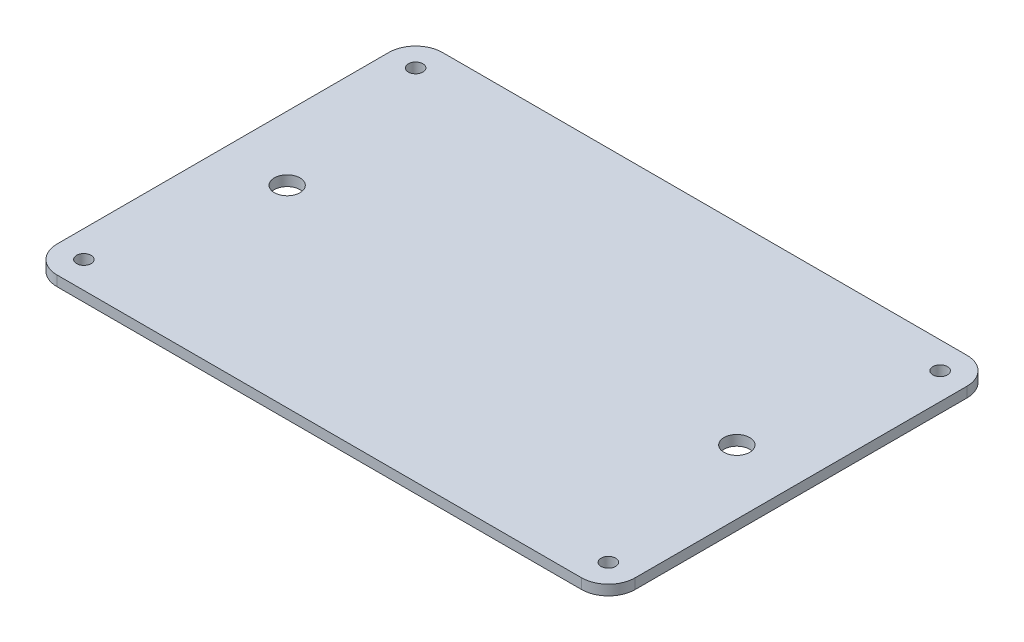
ISO-10303-21;
HEADER;
FILE_DESCRIPTION(('STEP AP214'),'2;1');
FILE_NAME('part.step','',(''),(''),'','','');
FILE_SCHEMA(('AUTOMOTIVE_DESIGN { 1 0 10303 214 1 1 1 1 }'));
ENDSEC;
DATA;
#1=APPLICATION_CONTEXT('core data for automotive mechanical design processes');
#2=APPLICATION_PROTOCOL_DEFINITION('international standard','automotive_design',2000,#1);
#3=PRODUCT_CONTEXT('',#1,'mechanical');
#4=PRODUCT('Part','Part','',(#3));
#5=PRODUCT_RELATED_PRODUCT_CATEGORY('part','',(#4));
#6=PRODUCT_DEFINITION_FORMATION('','',#4);
#7=PRODUCT_DEFINITION_CONTEXT('part definition',#1,'design');
#8=PRODUCT_DEFINITION('design','',#6,#7);
#9=PRODUCT_DEFINITION_SHAPE('','',#8);
#10=(LENGTH_UNIT() NAMED_UNIT(*) SI_UNIT(.MILLI.,.METRE.));
#11=(NAMED_UNIT(*) PLANE_ANGLE_UNIT() SI_UNIT($,.RADIAN.));
#12=(NAMED_UNIT(*) SI_UNIT($,.STERADIAN.) SOLID_ANGLE_UNIT());
#13=UNCERTAINTY_MEASURE_WITH_UNIT(LENGTH_MEASURE(1.E-05),#10,'distance_accuracy_value','');
#14=(GEOMETRIC_REPRESENTATION_CONTEXT(3) GLOBAL_UNCERTAINTY_ASSIGNED_CONTEXT((#13)) GLOBAL_UNIT_ASSIGNED_CONTEXT((#10,
#11,#12)) REPRESENTATION_CONTEXT('',''));
#15=CARTESIAN_POINT('',(0.,0.,0.));
#16=DIRECTION('',(0.,0.,1.));
#17=DIRECTION('',(1.,0.,0.));
#18=AXIS2_PLACEMENT_3D('',#15,#16,#17);
#19=CARTESIAN_POINT('',(-40.825,1.59,-25.825));
#20=DIRECTION('',(0.,1.,0.));
#21=DIRECTION('',(0.,0.,1.));
#22=AXIS2_PLACEMENT_3D('',#19,#20,#21);
#23=PLANE('',#22);
#24=CARTESIAN_POINT('',(35.,1.59,0.));
#25=DIRECTION('',(0.,-1.,0.));
#26=DIRECTION('',(0.,0.,-1.));
#27=AXIS2_PLACEMENT_3D('',#24,#25,#26);
#28=CIRCLE('',#27,2.);
#29=CARTESIAN_POINT('',(35.,1.59,-2.));
#30=VERTEX_POINT('',#29);
#31=EDGE_CURVE('E205',#30,#30,#28,.T.);
#32=ORIENTED_EDGE('',*,*,#31,.T.);
#33=EDGE_LOOP('',(#32));
#34=FACE_BOUND('',#33,.T.);
#35=CARTESIAN_POINT('',(-35.,1.59,0.));
#36=DIRECTION('',(0.,-1.,0.));
#37=DIRECTION('',(0.,0.,-1.));
#38=AXIS2_PLACEMENT_3D('',#35,#36,#37);
#39=CIRCLE('',#38,2.);
#40=CARTESIAN_POINT('',(-35.,1.59,-2.));
#41=VERTEX_POINT('',#40);
#42=EDGE_CURVE('E199',#41,#41,#39,.T.);
#43=ORIENTED_EDGE('',*,*,#42,.T.);
#44=EDGE_LOOP('',(#43));
#45=FACE_BOUND('',#44,.T.);
#46=CARTESIAN_POINT('',(-40.825,1.59,25.825));
#47=DIRECTION('',(0.,1.,0.));
#48=DIRECTION('',(0.,0.,1.));
#49=AXIS2_PLACEMENT_3D('',#46,#47,#48);
#50=CIRCLE('',#49,1.1303);
#51=CARTESIAN_POINT('',(-40.825,1.59,24.6947));
#52=VERTEX_POINT('',#51);
#53=EDGE_CURVE('E187',#52,#52,#50,.T.);
#54=ORIENTED_EDGE('',*,*,#53,.F.);
#55=EDGE_LOOP('',(#54));
#56=FACE_BOUND('',#55,.T.);
#57=CARTESIAN_POINT('',(40.825,1.59,-25.825));
#58=DIRECTION('',(0.,1.,0.));
#59=DIRECTION('',(0.,0.,1.));
#60=AXIS2_PLACEMENT_3D('',#57,#58,#59);
#61=CIRCLE('',#60,1.1303);
#62=CARTESIAN_POINT('',(40.825,1.59,-26.9553));
#63=VERTEX_POINT('',#62);
#64=EDGE_CURVE('E133',#63,#63,#61,.T.);
#65=ORIENTED_EDGE('',*,*,#64,.F.);
#66=EDGE_LOOP('',(#65));
#67=FACE_BOUND('',#66,.T.);
#68=CARTESIAN_POINT('',(-40.825,1.59,-25.825));
#69=DIRECTION('',(0.,1.,0.));
#70=DIRECTION('',(0.,0.,1.));
#71=AXIS2_PLACEMENT_3D('',#68,#69,#70);
#72=CIRCLE('',#71,4.17499999999999);
#73=CARTESIAN_POINT('',(-40.825,1.59,-30.));
#74=VERTEX_POINT('',#73);
#75=CARTESIAN_POINT('',(-45.,1.59,-25.825));
#76=VERTEX_POINT('',#75);
#77=EDGE_CURVE('E144',#74,#76,#72,.T.);
#78=ORIENTED_EDGE('',*,*,#77,.T.);
#79=DIRECTION('',(0.,0.,1.));
#80=VECTOR('',#79,1.);
#81=CARTESIAN_POINT('',(-45.,1.59,-25.825));
#82=LINE('',#81,#80);
#83=CARTESIAN_POINT('',(-45.,1.59,25.825));
#84=VERTEX_POINT('',#83);
#85=EDGE_CURVE('E92',#76,#84,#82,.T.);
#86=ORIENTED_EDGE('',*,*,#85,.T.);
#87=CARTESIAN_POINT('',(-40.825,1.59,25.825));
#88=DIRECTION('',(0.,1.,0.));
#89=DIRECTION('',(0.,0.,1.));
#90=AXIS2_PLACEMENT_3D('',#87,#88,#89);
#91=CIRCLE('',#90,4.17500000000001);
#92=CARTESIAN_POINT('',(-40.825,1.59,30.));
#93=VERTEX_POINT('',#92);
#94=EDGE_CURVE('E159',#84,#93,#91,.T.);
#95=ORIENTED_EDGE('',*,*,#94,.T.);
#96=DIRECTION('',(1.,0.,0.));
#97=VECTOR('',#96,1.);
#98=CARTESIAN_POINT('',(-40.825,1.59,30.));
#99=LINE('',#98,#97);
#100=CARTESIAN_POINT('',(40.825,1.59,30.));
#101=VERTEX_POINT('',#100);
#102=EDGE_CURVE('E172',#93,#101,#99,.T.);
#103=ORIENTED_EDGE('',*,*,#102,.T.);
#104=CARTESIAN_POINT('',(40.825,1.59,25.825));
#105=DIRECTION('',(0.,1.,0.));
#106=DIRECTION('',(0.,0.,1.));
#107=AXIS2_PLACEMENT_3D('',#104,#105,#106);
#108=CIRCLE('',#107,4.17499999999999);
#109=CARTESIAN_POINT('',(45.,1.59,25.825));
#110=VERTEX_POINT('',#109);
#111=EDGE_CURVE('E111',#101,#110,#108,.T.);
#112=ORIENTED_EDGE('',*,*,#111,.T.);
#113=DIRECTION('',(0.,0.,-1.));
#114=VECTOR('',#113,1.);
#115=CARTESIAN_POINT('',(45.,1.59,-25.825));
#116=LINE('',#115,#114);
#117=CARTESIAN_POINT('',(45.,1.59,-25.825));
#118=VERTEX_POINT('',#117);
#119=EDGE_CURVE('E105',#110,#118,#116,.T.);
#120=ORIENTED_EDGE('',*,*,#119,.T.);
#121=CARTESIAN_POINT('',(40.825,1.59,-25.825));
#122=DIRECTION('',(0.,1.,0.));
#123=DIRECTION('',(0.,0.,1.));
#124=AXIS2_PLACEMENT_3D('',#121,#122,#123);
#125=CIRCLE('',#124,4.175);
#126=CARTESIAN_POINT('',(40.825,1.59,-30.));
#127=VERTEX_POINT('',#126);
#128=EDGE_CURVE('E109',#118,#127,#125,.T.);
#129=ORIENTED_EDGE('',*,*,#128,.T.);
#130=DIRECTION('',(-1.,0.,0.));
#131=VECTOR('',#130,1.);
#132=CARTESIAN_POINT('',(-40.825,1.59,-30.));
#133=LINE('',#132,#131);
#134=EDGE_CURVE('E49',#127,#74,#133,.T.);
#135=ORIENTED_EDGE('',*,*,#134,.T.);
#136=EDGE_LOOP('',(#78,#86,#95,#103,#112,#120,#129,#135));
#137=FACE_BOUND('',#136,.T.);
#138=CARTESIAN_POINT('',(-40.825,1.59,-25.825));
#139=DIRECTION('',(0.,1.,0.));
#140=DIRECTION('',(0.,0.,1.));
#141=AXIS2_PLACEMENT_3D('',#138,#139,#140);
#142=CIRCLE('',#141,1.1303);
#143=CARTESIAN_POINT('',(-40.825,1.59,-26.9553));
#144=VERTEX_POINT('',#143);
#145=EDGE_CURVE('E181',#144,#144,#142,.T.);
#146=ORIENTED_EDGE('',*,*,#145,.F.);
#147=EDGE_LOOP('',(#146));
#148=FACE_BOUND('',#147,.T.);
#149=CARTESIAN_POINT('',(40.825,1.59,25.825));
#150=DIRECTION('',(0.,1.,0.));
#151=DIRECTION('',(0.,0.,1.));
#152=AXIS2_PLACEMENT_3D('',#149,#150,#151);
#153=CIRCLE('',#152,1.1303);
#154=CARTESIAN_POINT('',(40.825,1.59,24.6947));
#155=VERTEX_POINT('',#154);
#156=EDGE_CURVE('E193',#155,#155,#153,.T.);
#157=ORIENTED_EDGE('',*,*,#156,.F.);
#158=EDGE_LOOP('',(#157));
#159=FACE_BOUND('',#158,.T.);
#160=ADVANCED_FACE('F32',(#34,#45,#56,#67,#137,#148,#159),#23,.T.);
#161=CARTESIAN_POINT('',(-40.825,0.,-25.825));
#162=DIRECTION('',(0.,1.,0.));
#163=DIRECTION('',(0.,0.,1.));
#164=AXIS2_PLACEMENT_3D('',#161,#162,#163);
#165=PLANE('',#164);
#166=CARTESIAN_POINT('',(35.,0.,0.));
#167=DIRECTION('',(0.,-1.,0.));
#168=DIRECTION('',(0.,0.,-1.));
#169=AXIS2_PLACEMENT_3D('',#166,#167,#168);
#170=CIRCLE('',#169,2.);
#171=CARTESIAN_POINT('',(35.,0.,-2.));
#172=VERTEX_POINT('',#171);
#173=EDGE_CURVE('E208',#172,#172,#170,.T.);
#174=ORIENTED_EDGE('',*,*,#173,.F.);
#175=EDGE_LOOP('',(#174));
#176=FACE_BOUND('',#175,.T.);
#177=CARTESIAN_POINT('',(-35.,0.,0.));
#178=DIRECTION('',(0.,-1.,0.));
#179=DIRECTION('',(0.,0.,-1.));
#180=AXIS2_PLACEMENT_3D('',#177,#178,#179);
#181=CIRCLE('',#180,2.);
#182=CARTESIAN_POINT('',(-35.,0.,-2.));
#183=VERTEX_POINT('',#182);
#184=EDGE_CURVE('E202',#183,#183,#181,.T.);
#185=ORIENTED_EDGE('',*,*,#184,.F.);
#186=EDGE_LOOP('',(#185));
#187=FACE_BOUND('',#186,.T.);
#188=CARTESIAN_POINT('',(-40.825,0.,-25.825));
#189=DIRECTION('',(0.,1.,0.));
#190=DIRECTION('',(0.,0.,1.));
#191=AXIS2_PLACEMENT_3D('',#188,#189,#190);
#192=CIRCLE('',#191,4.17499999999999);
#193=CARTESIAN_POINT('',(-40.825,0.,-30.));
#194=VERTEX_POINT('',#193);
#195=CARTESIAN_POINT('',(-45.,0.,-25.825));
#196=VERTEX_POINT('',#195);
#197=EDGE_CURVE('E129',#194,#196,#192,.T.);
#198=ORIENTED_EDGE('',*,*,#197,.F.);
#199=DIRECTION('',(-1.,0.,0.));
#200=VECTOR('',#199,1.);
#201=CARTESIAN_POINT('',(-40.825,0.,-30.));
#202=LINE('',#201,#200);
#203=CARTESIAN_POINT('',(40.825,0.,-30.));
#204=VERTEX_POINT('',#203);
#205=EDGE_CURVE('E84',#204,#194,#202,.T.);
#206=ORIENTED_EDGE('',*,*,#205,.F.);
#207=CARTESIAN_POINT('',(40.825,0.,-25.825));
#208=DIRECTION('',(0.,1.,0.));
#209=DIRECTION('',(0.,0.,1.));
#210=AXIS2_PLACEMENT_3D('',#207,#208,#209);
#211=CIRCLE('',#210,4.175);
#212=CARTESIAN_POINT('',(45.,0.,-25.825));
#213=VERTEX_POINT('',#212);
#214=EDGE_CURVE('E78',#213,#204,#211,.T.);
#215=ORIENTED_EDGE('',*,*,#214,.F.);
#216=DIRECTION('',(0.,0.,-1.));
#217=VECTOR('',#216,1.);
#218=CARTESIAN_POINT('',(45.,0.,-25.825));
#219=LINE('',#218,#217);
#220=CARTESIAN_POINT('',(45.,0.,25.825));
#221=VERTEX_POINT('',#220);
#222=EDGE_CURVE('E119',#221,#213,#219,.T.);
#223=ORIENTED_EDGE('',*,*,#222,.F.);
#224=CARTESIAN_POINT('',(40.825,0.,25.825));
#225=DIRECTION('',(0.,1.,0.));
#226=DIRECTION('',(0.,0.,1.));
#227=AXIS2_PLACEMENT_3D('',#224,#225,#226);
#228=CIRCLE('',#227,4.17499999999999);
#229=CARTESIAN_POINT('',(40.825,0.,30.));
#230=VERTEX_POINT('',#229);
#231=EDGE_CURVE('E139',#230,#221,#228,.T.);
#232=ORIENTED_EDGE('',*,*,#231,.F.);
#233=DIRECTION('',(1.,0.,0.));
#234=VECTOR('',#233,1.);
#235=CARTESIAN_POINT('',(-40.825,0.,30.));
#236=LINE('',#235,#234);
#237=CARTESIAN_POINT('',(-40.825,0.,30.));
#238=VERTEX_POINT('',#237);
#239=EDGE_CURVE('E137',#238,#230,#236,.T.);
#240=ORIENTED_EDGE('',*,*,#239,.F.);
#241=CARTESIAN_POINT('',(-40.825,0.,25.825));
#242=DIRECTION('',(0.,1.,0.));
#243=DIRECTION('',(0.,0.,1.));
#244=AXIS2_PLACEMENT_3D('',#241,#242,#243);
#245=CIRCLE('',#244,4.17500000000001);
#246=CARTESIAN_POINT('',(-45.,0.,25.825));
#247=VERTEX_POINT('',#246);
#248=EDGE_CURVE('E135',#247,#238,#245,.T.);
#249=ORIENTED_EDGE('',*,*,#248,.F.);
#250=DIRECTION('',(0.,0.,1.));
#251=VECTOR('',#250,1.);
#252=CARTESIAN_POINT('',(-45.,0.,-25.825));
#253=LINE('',#252,#251);
#254=EDGE_CURVE('E132',#196,#247,#253,.T.);
#255=ORIENTED_EDGE('',*,*,#254,.F.);
#256=EDGE_LOOP('',(#198,#206,#215,#223,#232,#240,#249,#255));
#257=FACE_BOUND('',#256,.T.);
#258=CARTESIAN_POINT('',(40.825,0.,-25.825));
#259=DIRECTION('',(0.,1.,0.));
#260=DIRECTION('',(0.,0.,1.));
#261=AXIS2_PLACEMENT_3D('',#258,#259,#260);
#262=CIRCLE('',#261,1.1303);
#263=CARTESIAN_POINT('',(40.825,0.,-26.9553));
#264=VERTEX_POINT('',#263);
#265=EDGE_CURVE('E178',#264,#264,#262,.T.);
#266=ORIENTED_EDGE('',*,*,#265,.T.);
#267=EDGE_LOOP('',(#266));
#268=FACE_BOUND('',#267,.T.);
#269=CARTESIAN_POINT('',(-40.825,0.,-25.825));
#270=DIRECTION('',(0.,1.,0.));
#271=DIRECTION('',(0.,0.,1.));
#272=AXIS2_PLACEMENT_3D('',#269,#270,#271);
#273=CIRCLE('',#272,1.1303);
#274=CARTESIAN_POINT('',(-40.825,0.,-26.9553));
#275=VERTEX_POINT('',#274);
#276=EDGE_CURVE('E184',#275,#275,#273,.T.);
#277=ORIENTED_EDGE('',*,*,#276,.T.);
#278=EDGE_LOOP('',(#277));
#279=FACE_BOUND('',#278,.T.);
#280=CARTESIAN_POINT('',(-40.825,0.,25.825));
#281=DIRECTION('',(0.,1.,0.));
#282=DIRECTION('',(0.,0.,1.));
#283=AXIS2_PLACEMENT_3D('',#280,#281,#282);
#284=CIRCLE('',#283,1.1303);
#285=CARTESIAN_POINT('',(-40.825,0.,24.6947));
#286=VERTEX_POINT('',#285);
#287=EDGE_CURVE('E190',#286,#286,#284,.T.);
#288=ORIENTED_EDGE('',*,*,#287,.T.);
#289=EDGE_LOOP('',(#288));
#290=FACE_BOUND('',#289,.T.);
#291=CARTESIAN_POINT('',(40.825,0.,25.825));
#292=DIRECTION('',(0.,1.,0.));
#293=DIRECTION('',(0.,0.,1.));
#294=AXIS2_PLACEMENT_3D('',#291,#292,#293);
#295=CIRCLE('',#294,1.1303);
#296=CARTESIAN_POINT('',(40.825,0.,24.6947));
#297=VERTEX_POINT('',#296);
#298=EDGE_CURVE('E196',#297,#297,#295,.T.);
#299=ORIENTED_EDGE('',*,*,#298,.T.);
#300=EDGE_LOOP('',(#299));
#301=FACE_BOUND('',#300,.T.);
#302=ADVANCED_FACE('F163',(#176,#187,#257,#268,#279,#290,#301),#165,.F.);
#303=CARTESIAN_POINT('',(-40.825,1.59,-25.825));
#304=DIRECTION('',(0.,-1.,0.));
#305=DIRECTION('',(0.,0.,-1.));
#306=AXIS2_PLACEMENT_3D('',#303,#304,#305);
#307=CYLINDRICAL_SURFACE('',#306,4.17499999999999);
#308=ORIENTED_EDGE('',*,*,#197,.T.);
#309=DIRECTION('',(0.,-1.,0.));
#310=VECTOR('',#309,1.);
#311=CARTESIAN_POINT('',(-45.,1.59,-25.825));
#312=LINE('',#311,#310);
#313=EDGE_CURVE('E11',#76,#196,#312,.T.);
#314=ORIENTED_EDGE('',*,*,#313,.F.);
#315=ORIENTED_EDGE('',*,*,#77,.F.);
#316=DIRECTION('',(0.,-1.,0.));
#317=VECTOR('',#316,1.);
#318=CARTESIAN_POINT('',(-40.825,1.59,-30.));
#319=LINE('',#318,#317);
#320=EDGE_CURVE('E125',#74,#194,#319,.T.);
#321=ORIENTED_EDGE('',*,*,#320,.T.);
#322=EDGE_LOOP('',(#308,#314,#315,#321));
#323=FACE_BOUND('',#322,.T.);
#324=ADVANCED_FACE('F34',(#323),#307,.T.);
#325=CARTESIAN_POINT('',(-45.,1.59,-25.825));
#326=DIRECTION('',(1.,0.,0.));
#327=DIRECTION('',(0.,0.,-1.));
#328=AXIS2_PLACEMENT_3D('',#325,#326,#327);
#329=PLANE('',#328);
#330=ORIENTED_EDGE('',*,*,#254,.T.);
#331=DIRECTION('',(0.,-1.,0.));
#332=VECTOR('',#331,1.);
#333=CARTESIAN_POINT('',(-45.,1.59,25.825));
#334=LINE('',#333,#332);
#335=EDGE_CURVE('E41',#84,#247,#334,.T.);
#336=ORIENTED_EDGE('',*,*,#335,.F.);
#337=ORIENTED_EDGE('',*,*,#85,.F.);
#338=ORIENTED_EDGE('',*,*,#313,.T.);
#339=EDGE_LOOP('',(#330,#336,#337,#338));
#340=FACE_BOUND('',#339,.T.);
#341=ADVANCED_FACE('F259',(#340),#329,.F.);
#342=CARTESIAN_POINT('',(-40.825,1.59,25.825));
#343=DIRECTION('',(0.,-1.,0.));
#344=DIRECTION('',(0.,0.,-1.));
#345=AXIS2_PLACEMENT_3D('',#342,#343,#344);
#346=CYLINDRICAL_SURFACE('',#345,4.17500000000001);
#347=ORIENTED_EDGE('',*,*,#248,.T.);
#348=DIRECTION('',(0.,-1.,0.));
#349=VECTOR('',#348,1.);
#350=CARTESIAN_POINT('',(-40.825,1.59,30.));
#351=LINE('',#350,#349);
#352=EDGE_CURVE('E151',#93,#238,#351,.T.);
#353=ORIENTED_EDGE('',*,*,#352,.F.);
#354=ORIENTED_EDGE('',*,*,#94,.F.);
#355=ORIENTED_EDGE('',*,*,#335,.T.);
#356=EDGE_LOOP('',(#347,#353,#354,#355));
#357=FACE_BOUND('',#356,.T.);
#358=ADVANCED_FACE('F157',(#357),#346,.T.);
#359=CARTESIAN_POINT('',(-40.825,1.59,30.));
#360=DIRECTION('',(0.,0.,-1.));
#361=DIRECTION('',(-1.,0.,0.));
#362=AXIS2_PLACEMENT_3D('',#359,#360,#361);
#363=PLANE('',#362);
#364=ORIENTED_EDGE('',*,*,#239,.T.);
#365=DIRECTION('',(0.,-1.,0.));
#366=VECTOR('',#365,1.);
#367=CARTESIAN_POINT('',(40.825,1.59,30.));
#368=LINE('',#367,#366);
#369=EDGE_CURVE('E148',#101,#230,#368,.T.);
#370=ORIENTED_EDGE('',*,*,#369,.F.);
#371=ORIENTED_EDGE('',*,*,#102,.F.);
#372=ORIENTED_EDGE('',*,*,#352,.T.);
#373=EDGE_LOOP('',(#364,#370,#371,#372));
#374=FACE_BOUND('',#373,.T.);
#375=ADVANCED_FACE('F168',(#374),#363,.F.);
#376=CARTESIAN_POINT('',(40.825,1.59,25.825));
#377=DIRECTION('',(0.,-1.,0.));
#378=DIRECTION('',(0.,0.,-1.));
#379=AXIS2_PLACEMENT_3D('',#376,#377,#378);
#380=CYLINDRICAL_SURFACE('',#379,4.17499999999999);
#381=ORIENTED_EDGE('',*,*,#231,.T.);
#382=DIRECTION('',(0.,-1.,0.));
#383=VECTOR('',#382,1.);
#384=CARTESIAN_POINT('',(45.,1.59,25.825));
#385=LINE('',#384,#383);
#386=EDGE_CURVE('E120',#110,#221,#385,.T.);
#387=ORIENTED_EDGE('',*,*,#386,.F.);
#388=ORIENTED_EDGE('',*,*,#111,.F.);
#389=ORIENTED_EDGE('',*,*,#369,.T.);
#390=EDGE_LOOP('',(#381,#387,#388,#389));
#391=FACE_BOUND('',#390,.T.);
#392=ADVANCED_FACE('F171',(#391),#380,.T.);
#393=CARTESIAN_POINT('',(45.,1.59,-25.825));
#394=DIRECTION('',(-1.,0.,0.));
#395=DIRECTION('',(0.,0.,1.));
#396=AXIS2_PLACEMENT_3D('',#393,#394,#395);
#397=PLANE('',#396);
#398=ORIENTED_EDGE('',*,*,#222,.T.);
#399=DIRECTION('',(0.,-1.,0.));
#400=VECTOR('',#399,1.);
#401=CARTESIAN_POINT('',(45.,1.59,-25.825));
#402=LINE('',#401,#400);
#403=EDGE_CURVE('E116',#118,#213,#402,.T.);
#404=ORIENTED_EDGE('',*,*,#403,.F.);
#405=ORIENTED_EDGE('',*,*,#119,.F.);
#406=ORIENTED_EDGE('',*,*,#386,.T.);
#407=EDGE_LOOP('',(#398,#404,#405,#406));
#408=FACE_BOUND('',#407,.T.);
#409=ADVANCED_FACE('F117',(#408),#397,.F.);
#410=CARTESIAN_POINT('',(40.825,1.59,-25.825));
#411=DIRECTION('',(0.,-1.,0.));
#412=DIRECTION('',(0.,0.,-1.));
#413=AXIS2_PLACEMENT_3D('',#410,#411,#412);
#414=CYLINDRICAL_SURFACE('',#413,4.175);
#415=ORIENTED_EDGE('',*,*,#214,.T.);
#416=DIRECTION('',(0.,-1.,0.));
#417=VECTOR('',#416,1.);
#418=CARTESIAN_POINT('',(40.825,1.59,-30.));
#419=LINE('',#418,#417);
#420=EDGE_CURVE('E121',#127,#204,#419,.T.);
#421=ORIENTED_EDGE('',*,*,#420,.F.);
#422=ORIENTED_EDGE('',*,*,#128,.F.);
#423=ORIENTED_EDGE('',*,*,#403,.T.);
#424=EDGE_LOOP('',(#415,#421,#422,#423));
#425=FACE_BOUND('',#424,.T.);
#426=ADVANCED_FACE('F123',(#425),#414,.T.);
#427=CARTESIAN_POINT('',(-40.825,1.59,-30.));
#428=DIRECTION('',(0.,0.,1.));
#429=DIRECTION('',(1.,0.,0.));
#430=AXIS2_PLACEMENT_3D('',#427,#428,#429);
#431=PLANE('',#430);
#432=ORIENTED_EDGE('',*,*,#205,.T.);
#433=ORIENTED_EDGE('',*,*,#320,.F.);
#434=ORIENTED_EDGE('',*,*,#134,.F.);
#435=ORIENTED_EDGE('',*,*,#420,.T.);
#436=EDGE_LOOP('',(#432,#433,#434,#435));
#437=FACE_BOUND('',#436,.T.);
#438=ADVANCED_FACE('F247',(#437),#431,.F.);
#439=CARTESIAN_POINT('',(40.825,1.59,-25.825));
#440=DIRECTION('',(0.,-1.,0.));
#441=DIRECTION('',(0.,0.,-1.));
#442=AXIS2_PLACEMENT_3D('',#439,#440,#441);
#443=CYLINDRICAL_SURFACE('',#442,1.1303);
#444=CARTESIAN_POINT('',(40.825,1.59,-26.9553));
#445=CARTESIAN_POINT('',(40.825,1.5734375,-26.9553));
#446=CARTESIAN_POINT('',(40.825,1.556875,-26.9553));
#447=CARTESIAN_POINT('',(40.825,1.52375,-26.9553));
#448=CARTESIAN_POINT('',(40.825,1.5071875,-26.9553));
#449=CARTESIAN_POINT('',(40.825,1.4740625,-26.9553));
#450=CARTESIAN_POINT('',(40.825,1.4575,-26.9553));
#451=CARTESIAN_POINT('',(40.825,1.424375,-26.9553));
#452=CARTESIAN_POINT('',(40.825,1.4078125,-26.9553));
#453=CARTESIAN_POINT('',(40.825,1.3746875,-26.9553));
#454=CARTESIAN_POINT('',(40.825,1.358125,-26.9553));
#455=CARTESIAN_POINT('',(40.825,1.325,-26.9553));
#456=CARTESIAN_POINT('',(40.825,1.3084375,-26.9553));
#457=CARTESIAN_POINT('',(40.825,1.2753125,-26.9553));
#458=CARTESIAN_POINT('',(40.825,1.25875,-26.9553));
#459=CARTESIAN_POINT('',(40.825,1.225625,-26.9553));
#460=CARTESIAN_POINT('',(40.825,1.2090625,-26.9553));
#461=CARTESIAN_POINT('',(40.825,1.1759375,-26.9553));
#462=CARTESIAN_POINT('',(40.825,1.159375,-26.9553));
#463=CARTESIAN_POINT('',(40.825,1.12625,-26.9553));
#464=CARTESIAN_POINT('',(40.825,1.1096875,-26.9553));
#465=CARTESIAN_POINT('',(40.825,1.0765625,-26.9553));
#466=CARTESIAN_POINT('',(40.825,1.06,-26.9553));
#467=CARTESIAN_POINT('',(40.825,1.026875,-26.9553));
#468=CARTESIAN_POINT('',(40.825,1.0103125,-26.9553));
#469=CARTESIAN_POINT('',(40.825,0.9771875,-26.9553));
#470=CARTESIAN_POINT('',(40.825,0.960625,-26.9553));
#471=CARTESIAN_POINT('',(40.825,0.9275,-26.9553));
#472=CARTESIAN_POINT('',(40.825,0.9109375,-26.9553));
#473=CARTESIAN_POINT('',(40.825,0.8778125,-26.9553));
#474=CARTESIAN_POINT('',(40.825,0.86125,-26.9553));
#475=CARTESIAN_POINT('',(40.825,0.828125,-26.9553));
#476=CARTESIAN_POINT('',(40.825,0.8115625,-26.9553));
#477=CARTESIAN_POINT('',(40.825,0.7784375,-26.9553));
#478=CARTESIAN_POINT('',(40.825,0.761875,-26.9553));
#479=CARTESIAN_POINT('',(40.825,0.72875,-26.9553));
#480=CARTESIAN_POINT('',(40.825,0.7121875,-26.9553));
#481=CARTESIAN_POINT('',(40.825,0.6790625,-26.9553));
#482=CARTESIAN_POINT('',(40.825,0.6625,-26.9553));
#483=CARTESIAN_POINT('',(40.825,0.629375,-26.9553));
#484=CARTESIAN_POINT('',(40.825,0.6128125,-26.9553));
#485=CARTESIAN_POINT('',(40.825,0.5796875,-26.9553));
#486=CARTESIAN_POINT('',(40.825,0.563125,-26.9553));
#487=CARTESIAN_POINT('',(40.825,0.53,-26.9553));
#488=CARTESIAN_POINT('',(40.825,0.5134375,-26.9553));
#489=CARTESIAN_POINT('',(40.825,0.4803125,-26.9553));
#490=CARTESIAN_POINT('',(40.825,0.46375,-26.9553));
#491=CARTESIAN_POINT('',(40.825,0.430625,-26.9553));
#492=CARTESIAN_POINT('',(40.825,0.4140625,-26.9553));
#493=CARTESIAN_POINT('',(40.825,0.3809375,-26.9553));
#494=CARTESIAN_POINT('',(40.825,0.364375,-26.9553));
#495=CARTESIAN_POINT('',(40.825,0.33125,-26.9553));
#496=CARTESIAN_POINT('',(40.825,0.3146875,-26.9553));
#497=CARTESIAN_POINT('',(40.825,0.2815625,-26.9553));
#498=CARTESIAN_POINT('',(40.825,0.265,-26.9553));
#499=CARTESIAN_POINT('',(40.825,0.231875,-26.9553));
#500=CARTESIAN_POINT('',(40.825,0.2153125,-26.9553));
#501=CARTESIAN_POINT('',(40.825,0.1821875,-26.9553));
#502=CARTESIAN_POINT('',(40.825,0.165625,-26.9553));
#503=CARTESIAN_POINT('',(40.825,0.1325,-26.9553));
#504=CARTESIAN_POINT('',(40.825,0.1159375,-26.9553));
#505=CARTESIAN_POINT('',(40.825,0.0828125000000001,-26.9553));
#506=CARTESIAN_POINT('',(40.825,0.06625,-26.9553));
#507=CARTESIAN_POINT('',(40.825,0.033125,-26.9553));
#508=CARTESIAN_POINT('',(40.825,0.0165625,-26.9553));
#509=CARTESIAN_POINT('',(40.825,0.,-26.9553));
#510=B_SPLINE_CURVE_WITH_KNOTS('',3,(#444,#445,#446,#447,#448,#449,#450,#451,#452,#453,#454,
#455,#456,#457,#458,#459,#460,#461,#462,#463,#464,#465,#466,#467,#468,#469,#470,#471,#472,#473,
#474,#475,#476,#477,#478,#479,#480,#481,#482,#483,#484,#485,#486,#487,#488,#489,#490,#491,#492,
#493,#494,#495,#496,#497,#498,#499,#500,#501,#502,#503,#504,#505,#506,#507,#508,#509),
.UNSPECIFIED.,.F.,.F.,(4,2,2,2,2,2,2,2,2,2,2,2,2,2,2,2,2,2,2,2,2,2,2,2,2,2,2,2,2,2,2,2,4),(0.,
0.0496875,0.0993750000000001,0.1490625,0.19875,0.2484375,0.298125,0.3478125,0.3975,0.4471875,
0.496875,0.5465625,0.59625,0.6459375,0.695625,0.7453125,0.795,0.8446875,0.894375,0.9440625,
0.99375,1.0434375,1.093125,1.1428125,1.1925,1.2421875,1.291875,1.3415625,1.39125,1.4409375,
1.490625,1.5403125,1.59),.UNSPECIFIED.);
#511=EDGE_CURVE('BSEAM244',#63,#264,#510,.T.);
#512=ORIENTED_EDGE('',*,*,#64,.T.);
#513=ORIENTED_EDGE('',*,*,#265,.F.);
#514=ORIENTED_EDGE('',*,*,#511,.T.);
#515=ORIENTED_EDGE('',*,*,#511,.F.);
#516=EDGE_LOOP('',(#512,#514,#513,#515));
#517=FACE_BOUND('',#516,.T.);
#518=ADVANCED_FACE('F244',(#517),#443,.F.);
#519=CARTESIAN_POINT('',(-40.825,1.59,-25.825));
#520=DIRECTION('',(0.,-1.,0.));
#521=DIRECTION('',(0.,0.,-1.));
#522=AXIS2_PLACEMENT_3D('',#519,#520,#521);
#523=CYLINDRICAL_SURFACE('',#522,1.1303);
#524=CARTESIAN_POINT('',(-40.825,1.59,-26.9553));
#525=CARTESIAN_POINT('',(-40.825,1.5734375,-26.9553));
#526=CARTESIAN_POINT('',(-40.825,1.556875,-26.9553));
#527=CARTESIAN_POINT('',(-40.825,1.52375,-26.9553));
#528=CARTESIAN_POINT('',(-40.825,1.5071875,-26.9553));
#529=CARTESIAN_POINT('',(-40.825,1.4740625,-26.9553));
#530=CARTESIAN_POINT('',(-40.825,1.4575,-26.9553));
#531=CARTESIAN_POINT('',(-40.825,1.424375,-26.9553));
#532=CARTESIAN_POINT('',(-40.825,1.4078125,-26.9553));
#533=CARTESIAN_POINT('',(-40.825,1.3746875,-26.9553));
#534=CARTESIAN_POINT('',(-40.825,1.358125,-26.9553));
#535=CARTESIAN_POINT('',(-40.825,1.325,-26.9553));
#536=CARTESIAN_POINT('',(-40.825,1.3084375,-26.9553));
#537=CARTESIAN_POINT('',(-40.825,1.2753125,-26.9553));
#538=CARTESIAN_POINT('',(-40.825,1.25875,-26.9553));
#539=CARTESIAN_POINT('',(-40.825,1.225625,-26.9553));
#540=CARTESIAN_POINT('',(-40.825,1.2090625,-26.9553));
#541=CARTESIAN_POINT('',(-40.825,1.1759375,-26.9553));
#542=CARTESIAN_POINT('',(-40.825,1.159375,-26.9553));
#543=CARTESIAN_POINT('',(-40.825,1.12625,-26.9553));
#544=CARTESIAN_POINT('',(-40.825,1.1096875,-26.9553));
#545=CARTESIAN_POINT('',(-40.825,1.0765625,-26.9553));
#546=CARTESIAN_POINT('',(-40.825,1.06,-26.9553));
#547=CARTESIAN_POINT('',(-40.825,1.026875,-26.9553));
#548=CARTESIAN_POINT('',(-40.825,1.0103125,-26.9553));
#549=CARTESIAN_POINT('',(-40.825,0.9771875,-26.9553));
#550=CARTESIAN_POINT('',(-40.825,0.960625,-26.9553));
#551=CARTESIAN_POINT('',(-40.825,0.9275,-26.9553));
#552=CARTESIAN_POINT('',(-40.825,0.9109375,-26.9553));
#553=CARTESIAN_POINT('',(-40.825,0.8778125,-26.9553));
#554=CARTESIAN_POINT('',(-40.825,0.86125,-26.9553));
#555=CARTESIAN_POINT('',(-40.825,0.828125,-26.9553));
#556=CARTESIAN_POINT('',(-40.825,0.8115625,-26.9553));
#557=CARTESIAN_POINT('',(-40.825,0.7784375,-26.9553));
#558=CARTESIAN_POINT('',(-40.825,0.761875,-26.9553));
#559=CARTESIAN_POINT('',(-40.825,0.72875,-26.9553));
#560=CARTESIAN_POINT('',(-40.825,0.7121875,-26.9553));
#561=CARTESIAN_POINT('',(-40.825,0.6790625,-26.9553));
#562=CARTESIAN_POINT('',(-40.825,0.6625,-26.9553));
#563=CARTESIAN_POINT('',(-40.825,0.629375,-26.9553));
#564=CARTESIAN_POINT('',(-40.825,0.6128125,-26.9553));
#565=CARTESIAN_POINT('',(-40.825,0.5796875,-26.9553));
#566=CARTESIAN_POINT('',(-40.825,0.563125,-26.9553));
#567=CARTESIAN_POINT('',(-40.825,0.53,-26.9553));
#568=CARTESIAN_POINT('',(-40.825,0.5134375,-26.9553));
#569=CARTESIAN_POINT('',(-40.825,0.4803125,-26.9553));
#570=CARTESIAN_POINT('',(-40.825,0.46375,-26.9553));
#571=CARTESIAN_POINT('',(-40.825,0.430625,-26.9553));
#572=CARTESIAN_POINT('',(-40.825,0.4140625,-26.9553));
#573=CARTESIAN_POINT('',(-40.825,0.3809375,-26.9553));
#574=CARTESIAN_POINT('',(-40.825,0.364375,-26.9553));
#575=CARTESIAN_POINT('',(-40.825,0.33125,-26.9553));
#576=CARTESIAN_POINT('',(-40.825,0.3146875,-26.9553));
#577=CARTESIAN_POINT('',(-40.825,0.2815625,-26.9553));
#578=CARTESIAN_POINT('',(-40.825,0.265,-26.9553));
#579=CARTESIAN_POINT('',(-40.825,0.231875,-26.9553));
#580=CARTESIAN_POINT('',(-40.825,0.2153125,-26.9553));
#581=CARTESIAN_POINT('',(-40.825,0.1821875,-26.9553));
#582=CARTESIAN_POINT('',(-40.825,0.165625,-26.9553));
#583=CARTESIAN_POINT('',(-40.825,0.1325,-26.9553));
#584=CARTESIAN_POINT('',(-40.825,0.1159375,-26.9553));
#585=CARTESIAN_POINT('',(-40.825,0.0828125000000001,-26.9553));
#586=CARTESIAN_POINT('',(-40.825,0.06625,-26.9553));
#587=CARTESIAN_POINT('',(-40.825,0.033125,-26.9553));
#588=CARTESIAN_POINT('',(-40.825,0.0165625,-26.9553));
#589=CARTESIAN_POINT('',(-40.825,0.,-26.9553));
#590=B_SPLINE_CURVE_WITH_KNOTS('',3,(#524,#525,#526,#527,#528,#529,#530,#531,#532,#533,#534,
#535,#536,#537,#538,#539,#540,#541,#542,#543,#544,#545,#546,#547,#548,#549,#550,#551,#552,#553,
#554,#555,#556,#557,#558,#559,#560,#561,#562,#563,#564,#565,#566,#567,#568,#569,#570,#571,#572,
#573,#574,#575,#576,#577,#578,#579,#580,#581,#582,#583,#584,#585,#586,#587,#588,#589),
.UNSPECIFIED.,.F.,.F.,(4,2,2,2,2,2,2,2,2,2,2,2,2,2,2,2,2,2,2,2,2,2,2,2,2,2,2,2,2,2,2,2,4),(0.,
0.0496875,0.0993750000000001,0.1490625,0.19875,0.2484375,0.298125,0.3478125,0.3975,0.4471875,
0.496875,0.5465625,0.59625,0.6459375,0.695625,0.7453125,0.795,0.8446875,0.894375,0.9440625,
0.99375,1.0434375,1.093125,1.1428125,1.1925,1.2421875,1.291875,1.3415625,1.39125,1.4409375,
1.490625,1.5403125,1.59),.UNSPECIFIED.);
#591=EDGE_CURVE('BSEAM301',#144,#275,#590,.T.);
#592=ORIENTED_EDGE('',*,*,#145,.T.);
#593=ORIENTED_EDGE('',*,*,#276,.F.);
#594=ORIENTED_EDGE('',*,*,#591,.T.);
#595=ORIENTED_EDGE('',*,*,#591,.F.);
#596=EDGE_LOOP('',(#592,#594,#593,#595));
#597=FACE_BOUND('',#596,.T.);
#598=ADVANCED_FACE('F301',(#597),#523,.F.);
#599=CARTESIAN_POINT('',(-40.825,1.59,25.825));
#600=DIRECTION('',(0.,-1.,0.));
#601=DIRECTION('',(0.,0.,-1.));
#602=AXIS2_PLACEMENT_3D('',#599,#600,#601);
#603=CYLINDRICAL_SURFACE('',#602,1.1303);
#604=CARTESIAN_POINT('',(-40.825,1.59,24.6947));
#605=CARTESIAN_POINT('',(-40.825,1.5734375,24.6947));
#606=CARTESIAN_POINT('',(-40.825,1.556875,24.6947));
#607=CARTESIAN_POINT('',(-40.825,1.52375,24.6947));
#608=CARTESIAN_POINT('',(-40.825,1.5071875,24.6947));
#609=CARTESIAN_POINT('',(-40.825,1.4740625,24.6947));
#610=CARTESIAN_POINT('',(-40.825,1.4575,24.6947));
#611=CARTESIAN_POINT('',(-40.825,1.424375,24.6947));
#612=CARTESIAN_POINT('',(-40.825,1.4078125,24.6947));
#613=CARTESIAN_POINT('',(-40.825,1.3746875,24.6947));
#614=CARTESIAN_POINT('',(-40.825,1.358125,24.6947));
#615=CARTESIAN_POINT('',(-40.825,1.325,24.6947));
#616=CARTESIAN_POINT('',(-40.825,1.3084375,24.6947));
#617=CARTESIAN_POINT('',(-40.825,1.2753125,24.6947));
#618=CARTESIAN_POINT('',(-40.825,1.25875,24.6947));
#619=CARTESIAN_POINT('',(-40.825,1.225625,24.6947));
#620=CARTESIAN_POINT('',(-40.825,1.2090625,24.6947));
#621=CARTESIAN_POINT('',(-40.825,1.1759375,24.6947));
#622=CARTESIAN_POINT('',(-40.825,1.159375,24.6947));
#623=CARTESIAN_POINT('',(-40.825,1.12625,24.6947));
#624=CARTESIAN_POINT('',(-40.825,1.1096875,24.6947));
#625=CARTESIAN_POINT('',(-40.825,1.0765625,24.6947));
#626=CARTESIAN_POINT('',(-40.825,1.06,24.6947));
#627=CARTESIAN_POINT('',(-40.825,1.026875,24.6947));
#628=CARTESIAN_POINT('',(-40.825,1.0103125,24.6947));
#629=CARTESIAN_POINT('',(-40.825,0.9771875,24.6947));
#630=CARTESIAN_POINT('',(-40.825,0.960625,24.6947));
#631=CARTESIAN_POINT('',(-40.825,0.9275,24.6947));
#632=CARTESIAN_POINT('',(-40.825,0.9109375,24.6947));
#633=CARTESIAN_POINT('',(-40.825,0.8778125,24.6947));
#634=CARTESIAN_POINT('',(-40.825,0.86125,24.6947));
#635=CARTESIAN_POINT('',(-40.825,0.828125,24.6947));
#636=CARTESIAN_POINT('',(-40.825,0.8115625,24.6947));
#637=CARTESIAN_POINT('',(-40.825,0.7784375,24.6947));
#638=CARTESIAN_POINT('',(-40.825,0.761875,24.6947));
#639=CARTESIAN_POINT('',(-40.825,0.72875,24.6947));
#640=CARTESIAN_POINT('',(-40.825,0.7121875,24.6947));
#641=CARTESIAN_POINT('',(-40.825,0.6790625,24.6947));
#642=CARTESIAN_POINT('',(-40.825,0.6625,24.6947));
#643=CARTESIAN_POINT('',(-40.825,0.629375,24.6947));
#644=CARTESIAN_POINT('',(-40.825,0.6128125,24.6947));
#645=CARTESIAN_POINT('',(-40.825,0.5796875,24.6947));
#646=CARTESIAN_POINT('',(-40.825,0.563125,24.6947));
#647=CARTESIAN_POINT('',(-40.825,0.53,24.6947));
#648=CARTESIAN_POINT('',(-40.825,0.5134375,24.6947));
#649=CARTESIAN_POINT('',(-40.825,0.4803125,24.6947));
#650=CARTESIAN_POINT('',(-40.825,0.46375,24.6947));
#651=CARTESIAN_POINT('',(-40.825,0.430625,24.6947));
#652=CARTESIAN_POINT('',(-40.825,0.4140625,24.6947));
#653=CARTESIAN_POINT('',(-40.825,0.3809375,24.6947));
#654=CARTESIAN_POINT('',(-40.825,0.364375,24.6947));
#655=CARTESIAN_POINT('',(-40.825,0.33125,24.6947));
#656=CARTESIAN_POINT('',(-40.825,0.3146875,24.6947));
#657=CARTESIAN_POINT('',(-40.825,0.2815625,24.6947));
#658=CARTESIAN_POINT('',(-40.825,0.265,24.6947));
#659=CARTESIAN_POINT('',(-40.825,0.231875,24.6947));
#660=CARTESIAN_POINT('',(-40.825,0.2153125,24.6947));
#661=CARTESIAN_POINT('',(-40.825,0.1821875,24.6947));
#662=CARTESIAN_POINT('',(-40.825,0.165625,24.6947));
#663=CARTESIAN_POINT('',(-40.825,0.1325,24.6947));
#664=CARTESIAN_POINT('',(-40.825,0.1159375,24.6947));
#665=CARTESIAN_POINT('',(-40.825,0.0828125000000001,24.6947));
#666=CARTESIAN_POINT('',(-40.825,0.06625,24.6947));
#667=CARTESIAN_POINT('',(-40.825,0.033125,24.6947));
#668=CARTESIAN_POINT('',(-40.825,0.0165625,24.6947));
#669=CARTESIAN_POINT('',(-40.825,0.,24.6947));
#670=B_SPLINE_CURVE_WITH_KNOTS('',3,(#604,#605,#606,#607,#608,#609,#610,#611,#612,#613,#614,
#615,#616,#617,#618,#619,#620,#621,#622,#623,#624,#625,#626,#627,#628,#629,#630,#631,#632,#633,
#634,#635,#636,#637,#638,#639,#640,#641,#642,#643,#644,#645,#646,#647,#648,#649,#650,#651,#652,
#653,#654,#655,#656,#657,#658,#659,#660,#661,#662,#663,#664,#665,#666,#667,#668,#669),
.UNSPECIFIED.,.F.,.F.,(4,2,2,2,2,2,2,2,2,2,2,2,2,2,2,2,2,2,2,2,2,2,2,2,2,2,2,2,2,2,2,2,4),(0.,
0.0496875,0.0993750000000001,0.1490625,0.19875,0.2484375,0.298125,0.3478125,0.3975,0.4471875,
0.496875,0.5465625,0.59625,0.6459375,0.695625,0.7453125,0.795,0.8446875,0.894375,0.9440625,
0.99375,1.0434375,1.093125,1.1428125,1.1925,1.2421875,1.291875,1.3415625,1.39125,1.4409375,
1.490625,1.5403125,1.59),.UNSPECIFIED.);
#671=EDGE_CURVE('BSEAM235',#52,#286,#670,.T.);
#672=ORIENTED_EDGE('',*,*,#53,.T.);
#673=ORIENTED_EDGE('',*,*,#287,.F.);
#674=ORIENTED_EDGE('',*,*,#671,.T.);
#675=ORIENTED_EDGE('',*,*,#671,.F.);
#676=EDGE_LOOP('',(#672,#674,#673,#675));
#677=FACE_BOUND('',#676,.T.);
#678=ADVANCED_FACE('F235',(#677),#603,.F.);
#679=CARTESIAN_POINT('',(40.825,1.59,25.825));
#680=DIRECTION('',(0.,-1.,0.));
#681=DIRECTION('',(0.,0.,-1.));
#682=AXIS2_PLACEMENT_3D('',#679,#680,#681);
#683=CYLINDRICAL_SURFACE('',#682,1.1303);
#684=CARTESIAN_POINT('',(40.825,1.59,24.6947));
#685=CARTESIAN_POINT('',(40.825,1.5734375,24.6947));
#686=CARTESIAN_POINT('',(40.825,1.556875,24.6947));
#687=CARTESIAN_POINT('',(40.825,1.52375,24.6947));
#688=CARTESIAN_POINT('',(40.825,1.5071875,24.6947));
#689=CARTESIAN_POINT('',(40.825,1.4740625,24.6947));
#690=CARTESIAN_POINT('',(40.825,1.4575,24.6947));
#691=CARTESIAN_POINT('',(40.825,1.424375,24.6947));
#692=CARTESIAN_POINT('',(40.825,1.4078125,24.6947));
#693=CARTESIAN_POINT('',(40.825,1.3746875,24.6947));
#694=CARTESIAN_POINT('',(40.825,1.358125,24.6947));
#695=CARTESIAN_POINT('',(40.825,1.325,24.6947));
#696=CARTESIAN_POINT('',(40.825,1.3084375,24.6947));
#697=CARTESIAN_POINT('',(40.825,1.2753125,24.6947));
#698=CARTESIAN_POINT('',(40.825,1.25875,24.6947));
#699=CARTESIAN_POINT('',(40.825,1.225625,24.6947));
#700=CARTESIAN_POINT('',(40.825,1.2090625,24.6947));
#701=CARTESIAN_POINT('',(40.825,1.1759375,24.6947));
#702=CARTESIAN_POINT('',(40.825,1.159375,24.6947));
#703=CARTESIAN_POINT('',(40.825,1.12625,24.6947));
#704=CARTESIAN_POINT('',(40.825,1.1096875,24.6947));
#705=CARTESIAN_POINT('',(40.825,1.0765625,24.6947));
#706=CARTESIAN_POINT('',(40.825,1.06,24.6947));
#707=CARTESIAN_POINT('',(40.825,1.026875,24.6947));
#708=CARTESIAN_POINT('',(40.825,1.0103125,24.6947));
#709=CARTESIAN_POINT('',(40.825,0.9771875,24.6947));
#710=CARTESIAN_POINT('',(40.825,0.960625,24.6947));
#711=CARTESIAN_POINT('',(40.825,0.9275,24.6947));
#712=CARTESIAN_POINT('',(40.825,0.9109375,24.6947));
#713=CARTESIAN_POINT('',(40.825,0.8778125,24.6947));
#714=CARTESIAN_POINT('',(40.825,0.86125,24.6947));
#715=CARTESIAN_POINT('',(40.825,0.828125,24.6947));
#716=CARTESIAN_POINT('',(40.825,0.8115625,24.6947));
#717=CARTESIAN_POINT('',(40.825,0.7784375,24.6947));
#718=CARTESIAN_POINT('',(40.825,0.761875,24.6947));
#719=CARTESIAN_POINT('',(40.825,0.72875,24.6947));
#720=CARTESIAN_POINT('',(40.825,0.7121875,24.6947));
#721=CARTESIAN_POINT('',(40.825,0.6790625,24.6947));
#722=CARTESIAN_POINT('',(40.825,0.6625,24.6947));
#723=CARTESIAN_POINT('',(40.825,0.629375,24.6947));
#724=CARTESIAN_POINT('',(40.825,0.6128125,24.6947));
#725=CARTESIAN_POINT('',(40.825,0.5796875,24.6947));
#726=CARTESIAN_POINT('',(40.825,0.563125,24.6947));
#727=CARTESIAN_POINT('',(40.825,0.53,24.6947));
#728=CARTESIAN_POINT('',(40.825,0.5134375,24.6947));
#729=CARTESIAN_POINT('',(40.825,0.4803125,24.6947));
#730=CARTESIAN_POINT('',(40.825,0.46375,24.6947));
#731=CARTESIAN_POINT('',(40.825,0.430625,24.6947));
#732=CARTESIAN_POINT('',(40.825,0.4140625,24.6947));
#733=CARTESIAN_POINT('',(40.825,0.3809375,24.6947));
#734=CARTESIAN_POINT('',(40.825,0.364375,24.6947));
#735=CARTESIAN_POINT('',(40.825,0.33125,24.6947));
#736=CARTESIAN_POINT('',(40.825,0.3146875,24.6947));
#737=CARTESIAN_POINT('',(40.825,0.2815625,24.6947));
#738=CARTESIAN_POINT('',(40.825,0.265,24.6947));
#739=CARTESIAN_POINT('',(40.825,0.231875,24.6947));
#740=CARTESIAN_POINT('',(40.825,0.2153125,24.6947));
#741=CARTESIAN_POINT('',(40.825,0.1821875,24.6947));
#742=CARTESIAN_POINT('',(40.825,0.165625,24.6947));
#743=CARTESIAN_POINT('',(40.825,0.1325,24.6947));
#744=CARTESIAN_POINT('',(40.825,0.1159375,24.6947));
#745=CARTESIAN_POINT('',(40.825,0.0828125000000001,24.6947));
#746=CARTESIAN_POINT('',(40.825,0.06625,24.6947));
#747=CARTESIAN_POINT('',(40.825,0.033125,24.6947));
#748=CARTESIAN_POINT('',(40.825,0.0165625,24.6947));
#749=CARTESIAN_POINT('',(40.825,0.,24.6947));
#750=B_SPLINE_CURVE_WITH_KNOTS('',3,(#684,#685,#686,#687,#688,#689,#690,#691,#692,#693,#694,
#695,#696,#697,#698,#699,#700,#701,#702,#703,#704,#705,#706,#707,#708,#709,#710,#711,#712,#713,
#714,#715,#716,#717,#718,#719,#720,#721,#722,#723,#724,#725,#726,#727,#728,#729,#730,#731,#732,
#733,#734,#735,#736,#737,#738,#739,#740,#741,#742,#743,#744,#745,#746,#747,#748,#749),
.UNSPECIFIED.,.F.,.F.,(4,2,2,2,2,2,2,2,2,2,2,2,2,2,2,2,2,2,2,2,2,2,2,2,2,2,2,2,2,2,2,2,4),(0.,
0.0496875,0.0993750000000001,0.1490625,0.19875,0.2484375,0.298125,0.3478125,0.3975,0.4471875,
0.496875,0.5465625,0.59625,0.6459375,0.695625,0.7453125,0.795,0.8446875,0.894375,0.9440625,
0.99375,1.0434375,1.093125,1.1428125,1.1925,1.2421875,1.291875,1.3415625,1.39125,1.4409375,
1.490625,1.5403125,1.59),.UNSPECIFIED.);
#751=EDGE_CURVE('BSEAM229',#155,#297,#750,.T.);
#752=ORIENTED_EDGE('',*,*,#156,.T.);
#753=ORIENTED_EDGE('',*,*,#298,.F.);
#754=ORIENTED_EDGE('',*,*,#751,.T.);
#755=ORIENTED_EDGE('',*,*,#751,.F.);
#756=EDGE_LOOP('',(#752,#754,#753,#755));
#757=FACE_BOUND('',#756,.T.);
#758=ADVANCED_FACE('F229',(#757),#683,.F.);
#759=CARTESIAN_POINT('',(-35.,1.59,0.));
#760=DIRECTION('',(0.,-1.,0.));
#761=DIRECTION('',(0.,0.,-1.));
#762=AXIS2_PLACEMENT_3D('',#759,#760,#761);
#763=CYLINDRICAL_SURFACE('',#762,2.);
#764=CARTESIAN_POINT('',(-35.,1.59,-2.));
#765=CARTESIAN_POINT('',(-35.,1.5734375,-2.));
#766=CARTESIAN_POINT('',(-35.,1.556875,-2.));
#767=CARTESIAN_POINT('',(-35.,1.52375,-2.));
#768=CARTESIAN_POINT('',(-35.,1.5071875,-2.));
#769=CARTESIAN_POINT('',(-35.,1.4740625,-2.));
#770=CARTESIAN_POINT('',(-35.,1.4575,-2.));
#771=CARTESIAN_POINT('',(-35.,1.424375,-2.));
#772=CARTESIAN_POINT('',(-35.,1.4078125,-2.));
#773=CARTESIAN_POINT('',(-35.,1.3746875,-2.));
#774=CARTESIAN_POINT('',(-35.,1.358125,-2.));
#775=CARTESIAN_POINT('',(-35.,1.325,-2.));
#776=CARTESIAN_POINT('',(-35.,1.3084375,-2.));
#777=CARTESIAN_POINT('',(-35.,1.2753125,-2.));
#778=CARTESIAN_POINT('',(-35.,1.25875,-2.));
#779=CARTESIAN_POINT('',(-35.,1.225625,-2.));
#780=CARTESIAN_POINT('',(-35.,1.2090625,-2.));
#781=CARTESIAN_POINT('',(-35.,1.1759375,-2.));
#782=CARTESIAN_POINT('',(-35.,1.159375,-2.));
#783=CARTESIAN_POINT('',(-35.,1.12625,-2.));
#784=CARTESIAN_POINT('',(-35.,1.1096875,-2.));
#785=CARTESIAN_POINT('',(-35.,1.0765625,-2.));
#786=CARTESIAN_POINT('',(-35.,1.06,-2.));
#787=CARTESIAN_POINT('',(-35.,1.026875,-2.));
#788=CARTESIAN_POINT('',(-35.,1.0103125,-2.));
#789=CARTESIAN_POINT('',(-35.,0.9771875,-2.));
#790=CARTESIAN_POINT('',(-35.,0.960625,-2.));
#791=CARTESIAN_POINT('',(-35.,0.9275,-2.));
#792=CARTESIAN_POINT('',(-35.,0.9109375,-2.));
#793=CARTESIAN_POINT('',(-35.,0.8778125,-2.));
#794=CARTESIAN_POINT('',(-35.,0.86125,-2.));
#795=CARTESIAN_POINT('',(-35.,0.828125,-2.));
#796=CARTESIAN_POINT('',(-35.,0.8115625,-2.));
#797=CARTESIAN_POINT('',(-35.,0.7784375,-2.));
#798=CARTESIAN_POINT('',(-35.,0.761875,-2.));
#799=CARTESIAN_POINT('',(-35.,0.72875,-2.));
#800=CARTESIAN_POINT('',(-35.,0.7121875,-2.));
#801=CARTESIAN_POINT('',(-35.,0.6790625,-2.));
#802=CARTESIAN_POINT('',(-35.,0.6625,-2.));
#803=CARTESIAN_POINT('',(-35.,0.629375,-2.));
#804=CARTESIAN_POINT('',(-35.,0.6128125,-2.));
#805=CARTESIAN_POINT('',(-35.,0.5796875,-2.));
#806=CARTESIAN_POINT('',(-35.,0.563125,-2.));
#807=CARTESIAN_POINT('',(-35.,0.53,-2.));
#808=CARTESIAN_POINT('',(-35.,0.5134375,-2.));
#809=CARTESIAN_POINT('',(-35.,0.4803125,-2.));
#810=CARTESIAN_POINT('',(-35.,0.46375,-2.));
#811=CARTESIAN_POINT('',(-35.,0.430625,-2.));
#812=CARTESIAN_POINT('',(-35.,0.4140625,-2.));
#813=CARTESIAN_POINT('',(-35.,0.3809375,-2.));
#814=CARTESIAN_POINT('',(-35.,0.364375,-2.));
#815=CARTESIAN_POINT('',(-35.,0.33125,-2.));
#816=CARTESIAN_POINT('',(-35.,0.3146875,-2.));
#817=CARTESIAN_POINT('',(-35.,0.2815625,-2.));
#818=CARTESIAN_POINT('',(-35.,0.265,-2.));
#819=CARTESIAN_POINT('',(-35.,0.231875,-2.));
#820=CARTESIAN_POINT('',(-35.,0.2153125,-2.));
#821=CARTESIAN_POINT('',(-35.,0.1821875,-2.));
#822=CARTESIAN_POINT('',(-35.,0.165625,-2.));
#823=CARTESIAN_POINT('',(-35.,0.1325,-2.));
#824=CARTESIAN_POINT('',(-35.,0.1159375,-2.));
#825=CARTESIAN_POINT('',(-35.,0.0828125000000001,-2.));
#826=CARTESIAN_POINT('',(-35.,0.06625,-2.));
#827=CARTESIAN_POINT('',(-35.,0.033125,-2.));
#828=CARTESIAN_POINT('',(-35.,0.0165625,-2.));
#829=CARTESIAN_POINT('',(-35.,0.,-2.));
#830=B_SPLINE_CURVE_WITH_KNOTS('',3,(#764,#765,#766,#767,#768,#769,#770,#771,#772,#773,#774,
#775,#776,#777,#778,#779,#780,#781,#782,#783,#784,#785,#786,#787,#788,#789,#790,#791,#792,#793,
#794,#795,#796,#797,#798,#799,#800,#801,#802,#803,#804,#805,#806,#807,#808,#809,#810,#811,#812,
#813,#814,#815,#816,#817,#818,#819,#820,#821,#822,#823,#824,#825,#826,#827,#828,#829),
.UNSPECIFIED.,.F.,.F.,(4,2,2,2,2,2,2,2,2,2,2,2,2,2,2,2,2,2,2,2,2,2,2,2,2,2,2,2,2,2,2,2,4),(0.,
0.0496875,0.0993750000000001,0.1490625,0.19875,0.2484375,0.298125,0.3478125,0.3975,0.4471875,
0.496875,0.5465625,0.59625,0.6459375,0.695625,0.7453125,0.795,0.8446875,0.894375,0.9440625,
0.99375,1.0434375,1.093125,1.1428125,1.1925,1.2421875,1.291875,1.3415625,1.39125,1.4409375,
1.490625,1.5403125,1.59),.UNSPECIFIED.);
#831=EDGE_CURVE('BSEAM219',#41,#183,#830,.T.);
#832=ORIENTED_EDGE('',*,*,#42,.F.);
#833=ORIENTED_EDGE('',*,*,#184,.T.);
#834=ORIENTED_EDGE('',*,*,#831,.T.);
#835=ORIENTED_EDGE('',*,*,#831,.F.);
#836=EDGE_LOOP('',(#832,#834,#833,#835));
#837=FACE_BOUND('',#836,.T.);
#838=ADVANCED_FACE('F219',(#837),#763,.F.);
#839=CARTESIAN_POINT('',(35.,1.59,0.));
#840=DIRECTION('',(0.,-1.,0.));
#841=DIRECTION('',(0.,0.,-1.));
#842=AXIS2_PLACEMENT_3D('',#839,#840,#841);
#843=CYLINDRICAL_SURFACE('',#842,2.);
#844=CARTESIAN_POINT('',(35.,1.59,-2.));
#845=CARTESIAN_POINT('',(35.,1.5734375,-2.));
#846=CARTESIAN_POINT('',(35.,1.556875,-2.));
#847=CARTESIAN_POINT('',(35.,1.52375,-2.));
#848=CARTESIAN_POINT('',(35.,1.5071875,-2.));
#849=CARTESIAN_POINT('',(35.,1.4740625,-2.));
#850=CARTESIAN_POINT('',(35.,1.4575,-2.));
#851=CARTESIAN_POINT('',(35.,1.424375,-2.));
#852=CARTESIAN_POINT('',(35.,1.4078125,-2.));
#853=CARTESIAN_POINT('',(35.,1.3746875,-2.));
#854=CARTESIAN_POINT('',(35.,1.358125,-2.));
#855=CARTESIAN_POINT('',(35.,1.325,-2.));
#856=CARTESIAN_POINT('',(35.,1.3084375,-2.));
#857=CARTESIAN_POINT('',(35.,1.2753125,-2.));
#858=CARTESIAN_POINT('',(35.,1.25875,-2.));
#859=CARTESIAN_POINT('',(35.,1.225625,-2.));
#860=CARTESIAN_POINT('',(35.,1.2090625,-2.));
#861=CARTESIAN_POINT('',(35.,1.1759375,-2.));
#862=CARTESIAN_POINT('',(35.,1.159375,-2.));
#863=CARTESIAN_POINT('',(35.,1.12625,-2.));
#864=CARTESIAN_POINT('',(35.,1.1096875,-2.));
#865=CARTESIAN_POINT('',(35.,1.0765625,-2.));
#866=CARTESIAN_POINT('',(35.,1.06,-2.));
#867=CARTESIAN_POINT('',(35.,1.026875,-2.));
#868=CARTESIAN_POINT('',(35.,1.0103125,-2.));
#869=CARTESIAN_POINT('',(35.,0.9771875,-2.));
#870=CARTESIAN_POINT('',(35.,0.960625,-2.));
#871=CARTESIAN_POINT('',(35.,0.9275,-2.));
#872=CARTESIAN_POINT('',(35.,0.9109375,-2.));
#873=CARTESIAN_POINT('',(35.,0.8778125,-2.));
#874=CARTESIAN_POINT('',(35.,0.86125,-2.));
#875=CARTESIAN_POINT('',(35.,0.828125,-2.));
#876=CARTESIAN_POINT('',(35.,0.8115625,-2.));
#877=CARTESIAN_POINT('',(35.,0.7784375,-2.));
#878=CARTESIAN_POINT('',(35.,0.761875,-2.));
#879=CARTESIAN_POINT('',(35.,0.72875,-2.));
#880=CARTESIAN_POINT('',(35.,0.7121875,-2.));
#881=CARTESIAN_POINT('',(35.,0.6790625,-2.));
#882=CARTESIAN_POINT('',(35.,0.6625,-2.));
#883=CARTESIAN_POINT('',(35.,0.629375,-2.));
#884=CARTESIAN_POINT('',(35.,0.6128125,-2.));
#885=CARTESIAN_POINT('',(35.,0.5796875,-2.));
#886=CARTESIAN_POINT('',(35.,0.563125,-2.));
#887=CARTESIAN_POINT('',(35.,0.53,-2.));
#888=CARTESIAN_POINT('',(35.,0.5134375,-2.));
#889=CARTESIAN_POINT('',(35.,0.4803125,-2.));
#890=CARTESIAN_POINT('',(35.,0.46375,-2.));
#891=CARTESIAN_POINT('',(35.,0.430625,-2.));
#892=CARTESIAN_POINT('',(35.,0.4140625,-2.));
#893=CARTESIAN_POINT('',(35.,0.3809375,-2.));
#894=CARTESIAN_POINT('',(35.,0.364375,-2.));
#895=CARTESIAN_POINT('',(35.,0.33125,-2.));
#896=CARTESIAN_POINT('',(35.,0.3146875,-2.));
#897=CARTESIAN_POINT('',(35.,0.2815625,-2.));
#898=CARTESIAN_POINT('',(35.,0.265,-2.));
#899=CARTESIAN_POINT('',(35.,0.231875,-2.));
#900=CARTESIAN_POINT('',(35.,0.2153125,-2.));
#901=CARTESIAN_POINT('',(35.,0.1821875,-2.));
#902=CARTESIAN_POINT('',(35.,0.165625,-2.));
#903=CARTESIAN_POINT('',(35.,0.1325,-2.));
#904=CARTESIAN_POINT('',(35.,0.1159375,-2.));
#905=CARTESIAN_POINT('',(35.,0.0828125000000001,-2.));
#906=CARTESIAN_POINT('',(35.,0.06625,-2.));
#907=CARTESIAN_POINT('',(35.,0.033125,-2.));
#908=CARTESIAN_POINT('',(35.,0.0165625,-2.));
#909=CARTESIAN_POINT('',(35.,0.,-2.));
#910=B_SPLINE_CURVE_WITH_KNOTS('',3,(#844,#845,#846,#847,#848,#849,#850,#851,#852,#853,#854,
#855,#856,#857,#858,#859,#860,#861,#862,#863,#864,#865,#866,#867,#868,#869,#870,#871,#872,#873,
#874,#875,#876,#877,#878,#879,#880,#881,#882,#883,#884,#885,#886,#887,#888,#889,#890,#891,#892,
#893,#894,#895,#896,#897,#898,#899,#900,#901,#902,#903,#904,#905,#906,#907,#908,#909),
.UNSPECIFIED.,.F.,.F.,(4,2,2,2,2,2,2,2,2,2,2,2,2,2,2,2,2,2,2,2,2,2,2,2,2,2,2,2,2,2,2,2,4),(0.,
0.0496875,0.0993750000000001,0.1490625,0.19875,0.2484375,0.298125,0.3478125,0.3975,0.4471875,
0.496875,0.5465625,0.59625,0.6459375,0.695625,0.7453125,0.795,0.8446875,0.894375,0.9440625,
0.99375,1.0434375,1.093125,1.1428125,1.1925,1.2421875,1.291875,1.3415625,1.39125,1.4409375,
1.490625,1.5403125,1.59),.UNSPECIFIED.);
#911=EDGE_CURVE('BSEAM216',#30,#172,#910,.T.);
#912=ORIENTED_EDGE('',*,*,#31,.F.);
#913=ORIENTED_EDGE('',*,*,#173,.T.);
#914=ORIENTED_EDGE('',*,*,#911,.T.);
#915=ORIENTED_EDGE('',*,*,#911,.F.);
#916=EDGE_LOOP('',(#912,#914,#913,#915));
#917=FACE_BOUND('',#916,.T.);
#918=ADVANCED_FACE('F216',(#917),#843,.F.);
#919=CLOSED_SHELL('',(#160,#302,#324,#341,#358,#375,#392,#409,#426,#438,#518,#598,#678,#758,
#838,#918));
#920=MANIFOLD_SOLID_BREP('B2',#919);
#921=ADVANCED_BREP_SHAPE_REPRESENTATION('',(#18,#920),#14);
#922=SHAPE_DEFINITION_REPRESENTATION(#9,#921);
ENDSEC;
END-ISO-10303-21;
